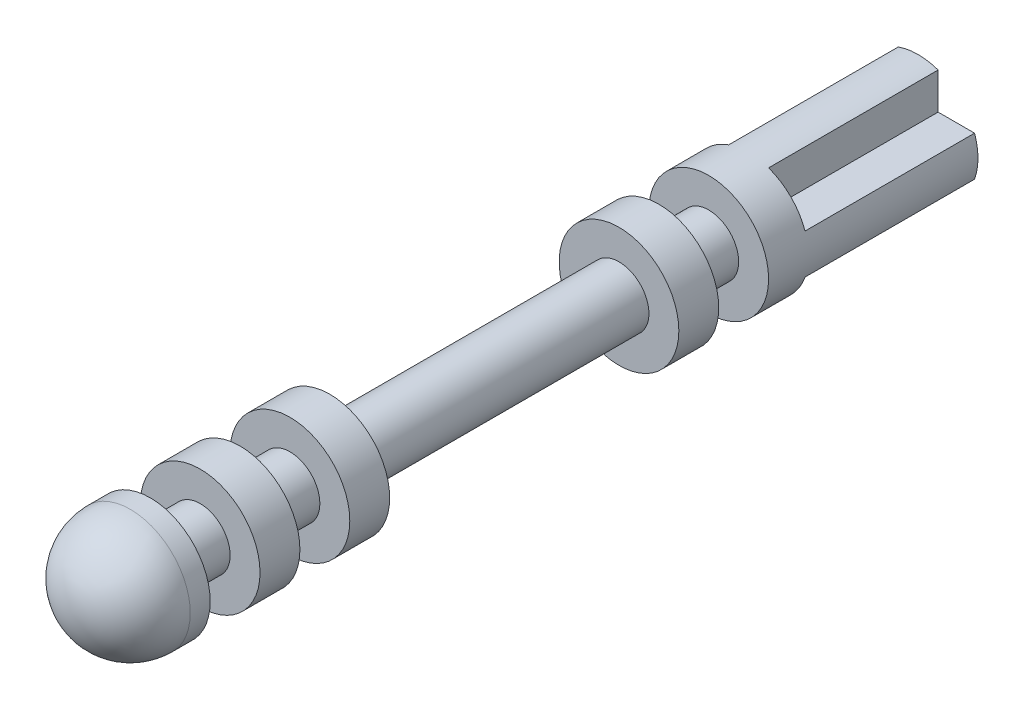
ISO-10303-21;
HEADER;
FILE_DESCRIPTION(('STEP AP214'),'2;1');
FILE_NAME('part.step','',(''),(''),'','','');
FILE_SCHEMA(('AUTOMOTIVE_DESIGN { 1 0 10303 214 1 1 1 1 }'));
ENDSEC;
DATA;
#1=APPLICATION_CONTEXT('core data for automotive mechanical design processes');
#2=APPLICATION_PROTOCOL_DEFINITION('international standard','automotive_design',2000,#1);
#3=PRODUCT_CONTEXT('',#1,'mechanical');
#4=PRODUCT('Part','Part','',(#3));
#5=PRODUCT_RELATED_PRODUCT_CATEGORY('part','',(#4));
#6=PRODUCT_DEFINITION_FORMATION('','',#4);
#7=PRODUCT_DEFINITION_CONTEXT('part definition',#1,'design');
#8=PRODUCT_DEFINITION('design','',#6,#7);
#9=PRODUCT_DEFINITION_SHAPE('','',#8);
#10=(LENGTH_UNIT() NAMED_UNIT(*) SI_UNIT(.MILLI.,.METRE.));
#11=(NAMED_UNIT(*) PLANE_ANGLE_UNIT() SI_UNIT($,.RADIAN.));
#12=(NAMED_UNIT(*) SI_UNIT($,.STERADIAN.) SOLID_ANGLE_UNIT());
#13=UNCERTAINTY_MEASURE_WITH_UNIT(LENGTH_MEASURE(1.E-05),#10,'distance_accuracy_value','');
#14=(GEOMETRIC_REPRESENTATION_CONTEXT(3) GLOBAL_UNCERTAINTY_ASSIGNED_CONTEXT((#13)) GLOBAL_UNIT_ASSIGNED_CONTEXT((#10,
#11,#12)) REPRESENTATION_CONTEXT('',''));
#15=CARTESIAN_POINT('',(0.,0.,0.));
#16=DIRECTION('',(0.,0.,1.));
#17=DIRECTION('',(1.,0.,0.));
#18=AXIS2_PLACEMENT_3D('',#15,#16,#17);
#19=CARTESIAN_POINT('',(0.,0.,10.5));
#20=DIRECTION('',(0.,0.,-1.));
#21=DIRECTION('',(-1.,0.,0.));
#22=AXIS2_PLACEMENT_3D('',#19,#20,#21);
#23=CYLINDRICAL_SURFACE('',#22,3.);
#24=CARTESIAN_POINT('',(0.,0.,10.5));
#25=DIRECTION('',(0.,0.,1.));
#26=DIRECTION('',(1.,0.,0.));
#27=AXIS2_PLACEMENT_3D('',#24,#25,#26);
#28=CIRCLE('',#27,3.);
#29=CARTESIAN_POINT('',(3.,0.,10.5));
#30=VERTEX_POINT('',#29);
#31=EDGE_CURVE('E305',#30,#30,#28,.T.);
#32=ORIENTED_EDGE('',*,*,#31,.F.);
#33=EDGE_LOOP('',(#32));
#34=FACE_BOUND('',#33,.T.);
#35=DIRECTION('',(0.,0.,1.));
#36=VECTOR('',#35,1.);
#37=CARTESIAN_POINT('',(-1.,-2.82842712474619,-93.5484771359565));
#38=LINE('',#37,#36);
#39=CARTESIAN_POINT('',(-1.,-2.82842712474619,0.));
#40=VERTEX_POINT('',#39);
#41=CARTESIAN_POINT('',(-1.,-2.82842712474619,8.5));
#42=VERTEX_POINT('',#41);
#43=EDGE_CURVE('E163',#40,#42,#38,.T.);
#44=ORIENTED_EDGE('',*,*,#43,.F.);
#45=CARTESIAN_POINT('',(0.,0.,0.));
#46=DIRECTION('',(0.,0.,1.));
#47=DIRECTION('',(1.,0.,0.));
#48=AXIS2_PLACEMENT_3D('',#45,#46,#47);
#49=CIRCLE('',#48,3.);
#50=CARTESIAN_POINT('',(1.,-2.82842712474619,0.));
#51=VERTEX_POINT('',#50);
#52=EDGE_CURVE('E314',#40,#51,#49,.T.);
#53=ORIENTED_EDGE('',*,*,#52,.T.);
#54=DIRECTION('',(0.,0.,1.));
#55=VECTOR('',#54,1.);
#56=CARTESIAN_POINT('',(1.,-2.82842712474619,-93.5484771359565));
#57=LINE('',#56,#55);
#58=CARTESIAN_POINT('',(1.,-2.82842712474619,8.5));
#59=VERTEX_POINT('',#58);
#60=EDGE_CURVE('E194',#51,#59,#57,.T.);
#61=ORIENTED_EDGE('',*,*,#60,.T.);
#62=CARTESIAN_POINT('',(0.,0.,8.5));
#63=DIRECTION('',(0.,0.,-1.));
#64=DIRECTION('',(1.,0.,0.));
#65=AXIS2_PLACEMENT_3D('',#62,#63,#64);
#66=CIRCLE('',#65,3.);
#67=CARTESIAN_POINT('',(2.82842712474619,-1.,8.5));
#68=VERTEX_POINT('',#67);
#69=EDGE_CURVE('E171',#68,#59,#66,.T.);
#70=ORIENTED_EDGE('',*,*,#69,.F.);
#71=DIRECTION('',(0.,0.,1.));
#72=VECTOR('',#71,1.);
#73=CARTESIAN_POINT('',(2.82842712474619,-1.,-93.5484771359565));
#74=LINE('',#73,#72);
#75=CARTESIAN_POINT('',(2.82842712474619,-1.,0.));
#76=VERTEX_POINT('',#75);
#77=EDGE_CURVE('E188',#76,#68,#74,.T.);
#78=ORIENTED_EDGE('',*,*,#77,.F.);
#79=CARTESIAN_POINT('',(2.82842712474619,1.,0.));
#80=VERTEX_POINT('',#79);
#81=EDGE_CURVE('E304',#76,#80,#49,.T.);
#82=ORIENTED_EDGE('',*,*,#81,.T.);
#83=DIRECTION('',(0.,0.,1.));
#84=VECTOR('',#83,1.);
#85=CARTESIAN_POINT('',(2.82842712474619,1.,-93.5484771359565));
#86=LINE('',#85,#84);
#87=CARTESIAN_POINT('',(2.82842712474619,1.,8.5));
#88=VERTEX_POINT('',#87);
#89=EDGE_CURVE('E232',#80,#88,#86,.T.);
#90=ORIENTED_EDGE('',*,*,#89,.T.);
#91=CARTESIAN_POINT('',(0.,0.,8.5));
#92=DIRECTION('',(0.,0.,1.));
#93=DIRECTION('',(1.,0.,0.));
#94=AXIS2_PLACEMENT_3D('',#91,#92,#93);
#95=CIRCLE('',#94,3.);
#96=CARTESIAN_POINT('',(1.,2.82842712474619,8.5));
#97=VERTEX_POINT('',#96);
#98=EDGE_CURVE('E227',#88,#97,#95,.T.);
#99=ORIENTED_EDGE('',*,*,#98,.T.);
#100=DIRECTION('',(0.,0.,1.));
#101=VECTOR('',#100,1.);
#102=CARTESIAN_POINT('',(1.,2.82842712474619,-93.5484771359565));
#103=LINE('',#102,#101);
#104=CARTESIAN_POINT('',(1.,2.82842712474619,0.));
#105=VERTEX_POINT('',#104);
#106=EDGE_CURVE('E248',#105,#97,#103,.T.);
#107=ORIENTED_EDGE('',*,*,#106,.F.);
#108=CARTESIAN_POINT('',(-1.,2.82842712474619,0.));
#109=VERTEX_POINT('',#108);
#110=EDGE_CURVE('E310',#105,#109,#49,.T.);
#111=ORIENTED_EDGE('',*,*,#110,.T.);
#112=DIRECTION('',(0.,0.,1.));
#113=VECTOR('',#112,1.);
#114=CARTESIAN_POINT('',(-1.,2.82842712474619,-93.5484771359565));
#115=LINE('',#114,#113);
#116=CARTESIAN_POINT('',(-1.,2.82842712474619,8.5));
#117=VERTEX_POINT('',#116);
#118=EDGE_CURVE('E223',#109,#117,#115,.T.);
#119=ORIENTED_EDGE('',*,*,#118,.T.);
#120=CARTESIAN_POINT('',(0.,0.,8.5));
#121=DIRECTION('',(0.,0.,-1.));
#122=DIRECTION('',(-1.,0.,0.));
#123=AXIS2_PLACEMENT_3D('',#120,#121,#122);
#124=CIRCLE('',#123,3.);
#125=CARTESIAN_POINT('',(-2.82842712474619,1.,8.5));
#126=VERTEX_POINT('',#125);
#127=EDGE_CURVE('E198',#126,#117,#124,.T.);
#128=ORIENTED_EDGE('',*,*,#127,.F.);
#129=DIRECTION('',(0.,0.,1.));
#130=VECTOR('',#129,1.);
#131=CARTESIAN_POINT('',(-2.82842712474619,1.,-93.5484771359565));
#132=LINE('',#131,#130);
#133=CARTESIAN_POINT('',(-2.82842712474619,1.,0.));
#134=VERTEX_POINT('',#133);
#135=EDGE_CURVE('E216',#134,#126,#132,.T.);
#136=ORIENTED_EDGE('',*,*,#135,.F.);
#137=CARTESIAN_POINT('',(-2.82842712474619,-1.,0.));
#138=VERTEX_POINT('',#137);
#139=EDGE_CURVE('E156',#134,#138,#49,.T.);
#140=ORIENTED_EDGE('',*,*,#139,.T.);
#141=DIRECTION('',(0.,0.,1.));
#142=VECTOR('',#141,1.);
#143=CARTESIAN_POINT('',(-2.82842712474619,-1.,-93.5484771359565));
#144=LINE('',#143,#142);
#145=CARTESIAN_POINT('',(-2.82842712474619,-1.,8.5));
#146=VERTEX_POINT('',#145);
#147=EDGE_CURVE('E61',#138,#146,#144,.T.);
#148=ORIENTED_EDGE('',*,*,#147,.T.);
#149=CARTESIAN_POINT('',(0.,0.,8.5));
#150=DIRECTION('',(0.,0.,1.));
#151=DIRECTION('',(-1.,0.,0.));
#152=AXIS2_PLACEMENT_3D('',#149,#150,#151);
#153=CIRCLE('',#152,3.);
#154=EDGE_CURVE('E137',#146,#42,#153,.T.);
#155=ORIENTED_EDGE('',*,*,#154,.T.);
#156=EDGE_LOOP('',(#44,#53,#61,#70,#78,#82,#90,#99,#107,#111,#119,#128,#136,#140,#148,#155));
#157=FACE_BOUND('',#156,.T.);
#158=ADVANCED_FACE('F45',(#34,#157),#23,.T.);
#159=CARTESIAN_POINT('',(0.,0.,0.));
#160=DIRECTION('',(0.,0.,1.));
#161=DIRECTION('',(1.,0.,0.));
#162=AXIS2_PLACEMENT_3D('',#159,#160,#161);
#163=PLANE('',#162);
#164=DIRECTION('',(0.,1.,0.));
#165=VECTOR('',#164,1.);
#166=CARTESIAN_POINT('',(-1.,-1.,0.));
#167=LINE('',#166,#165);
#168=CARTESIAN_POINT('',(-1.,-1.,0.));
#169=VERTEX_POINT('',#168);
#170=EDGE_CURVE('E158',#40,#169,#167,.T.);
#171=ORIENTED_EDGE('',*,*,#170,.T.);
#172=DIRECTION('',(-1.,0.,0.));
#173=VECTOR('',#172,1.);
#174=CARTESIAN_POINT('',(-2.82842712474619,-1.,0.));
#175=LINE('',#174,#173);
#176=EDGE_CURVE('E165',#169,#138,#175,.T.);
#177=ORIENTED_EDGE('',*,*,#176,.T.);
#178=ORIENTED_EDGE('',*,*,#139,.F.);
#179=DIRECTION('',(-1.,0.,0.));
#180=VECTOR('',#179,1.);
#181=CARTESIAN_POINT('',(-2.82842712474619,1.,0.));
#182=LINE('',#181,#180);
#183=CARTESIAN_POINT('',(-1.,1.,0.));
#184=VERTEX_POINT('',#183);
#185=EDGE_CURVE('E209',#184,#134,#182,.T.);
#186=ORIENTED_EDGE('',*,*,#185,.F.);
#187=DIRECTION('',(0.,-1.,0.));
#188=VECTOR('',#187,1.);
#189=CARTESIAN_POINT('',(-1.,1.,0.));
#190=LINE('',#189,#188);
#191=EDGE_CURVE('E220',#109,#184,#190,.T.);
#192=ORIENTED_EDGE('',*,*,#191,.F.);
#193=ORIENTED_EDGE('',*,*,#110,.F.);
#194=DIRECTION('',(0.,-1.,0.));
#195=VECTOR('',#194,1.);
#196=CARTESIAN_POINT('',(1.,1.,0.));
#197=LINE('',#196,#195);
#198=CARTESIAN_POINT('',(1.,1.,0.));
#199=VERTEX_POINT('',#198);
#200=EDGE_CURVE('E238',#105,#199,#197,.T.);
#201=ORIENTED_EDGE('',*,*,#200,.T.);
#202=DIRECTION('',(1.,0.,0.));
#203=VECTOR('',#202,1.);
#204=CARTESIAN_POINT('',(2.82842712474619,1.,0.));
#205=LINE('',#204,#203);
#206=EDGE_CURVE('E237',#199,#80,#205,.T.);
#207=ORIENTED_EDGE('',*,*,#206,.T.);
#208=ORIENTED_EDGE('',*,*,#81,.F.);
#209=DIRECTION('',(1.,0.,0.));
#210=VECTOR('',#209,1.);
#211=CARTESIAN_POINT('',(2.82842712474619,-1.,0.));
#212=LINE('',#211,#210);
#213=CARTESIAN_POINT('',(1.,-1.,0.));
#214=VERTEX_POINT('',#213);
#215=EDGE_CURVE('E182',#214,#76,#212,.T.);
#216=ORIENTED_EDGE('',*,*,#215,.F.);
#217=DIRECTION('',(0.,1.,0.));
#218=VECTOR('',#217,1.);
#219=CARTESIAN_POINT('',(1.,-1.,0.));
#220=LINE('',#219,#218);
#221=EDGE_CURVE('E69',#51,#214,#220,.T.);
#222=ORIENTED_EDGE('',*,*,#221,.F.);
#223=ORIENTED_EDGE('',*,*,#52,.F.);
#224=EDGE_LOOP('',(#171,#177,#178,#186,#192,#193,#201,#207,#208,#216,#222,#223));
#225=FACE_BOUND('',#224,.T.);
#226=ADVANCED_FACE('F355',(#225),#163,.F.);
#227=CARTESIAN_POINT('',(0.,0.,38.5));
#228=DIRECTION('',(0.,0.,-1.));
#229=DIRECTION('',(-1.,0.,0.));
#230=AXIS2_PLACEMENT_3D('',#227,#228,#229);
#231=CYLINDRICAL_SURFACE('',#230,1.5);
#232=CARTESIAN_POINT('',(0.,0.,31.5));
#233=DIRECTION('',(0.,0.,1.));
#234=DIRECTION('',(1.,0.,0.));
#235=AXIS2_PLACEMENT_3D('',#232,#233,#234);
#236=CIRCLE('',#235,1.5);
#237=CARTESIAN_POINT('',(1.5,0.,31.5));
#238=VERTEX_POINT('',#237);
#239=EDGE_CURVE('E275',#238,#238,#236,.T.);
#240=ORIENTED_EDGE('',*,*,#239,.T.);
#241=EDGE_LOOP('',(#240));
#242=FACE_BOUND('',#241,.T.);
#243=CARTESIAN_POINT('',(0.,0.,34.));
#244=DIRECTION('',(0.,0.,1.));
#245=DIRECTION('',(1.,0.,0.));
#246=AXIS2_PLACEMENT_3D('',#243,#244,#245);
#247=CIRCLE('',#246,1.5);
#248=CARTESIAN_POINT('',(1.5,0.,34.));
#249=VERTEX_POINT('',#248);
#250=EDGE_CURVE('E54',#249,#249,#247,.T.);
#251=ORIENTED_EDGE('',*,*,#250,.F.);
#252=EDGE_LOOP('',(#251));
#253=FACE_BOUND('',#252,.T.);
#254=ADVANCED_FACE('F352',(#242,#253),#231,.T.);
#255=CARTESIAN_POINT('',(0.,0.,15.));
#256=DIRECTION('',(0.,0.,1.));
#257=DIRECTION('',(1.,0.,0.));
#258=AXIS2_PLACEMENT_3D('',#255,#256,#257);
#259=CIRCLE('',#258,1.5);
#260=CARTESIAN_POINT('',(1.5,0.,15.));
#261=VERTEX_POINT('',#260);
#262=EDGE_CURVE('E284',#261,#261,#259,.F.);
#263=ORIENTED_EDGE('',*,*,#262,.F.);
#264=EDGE_LOOP('',(#263));
#265=FACE_BOUND('',#264,.T.);
#266=CARTESIAN_POINT('',(0.,0.,29.5));
#267=DIRECTION('',(0.,0.,1.));
#268=DIRECTION('',(1.,0.,0.));
#269=AXIS2_PLACEMENT_3D('',#266,#267,#268);
#270=CIRCLE('',#269,1.5);
#271=CARTESIAN_POINT('',(1.5,0.,29.5));
#272=VERTEX_POINT('',#271);
#273=EDGE_CURVE('E309',#272,#272,#270,.T.);
#274=ORIENTED_EDGE('',*,*,#273,.F.);
#275=EDGE_LOOP('',(#274));
#276=FACE_BOUND('',#275,.T.);
#277=ADVANCED_FACE('F353',(#265,#276),#231,.T.);
#278=CARTESIAN_POINT('',(0.,0.,10.5));
#279=DIRECTION('',(0.,0.,1.));
#280=DIRECTION('',(1.,0.,0.));
#281=AXIS2_PLACEMENT_3D('',#278,#279,#280);
#282=PLANE('',#281);
#283=CARTESIAN_POINT('',(0.,0.,10.5));
#284=DIRECTION('',(0.,0.,1.));
#285=DIRECTION('',(1.,0.,0.));
#286=AXIS2_PLACEMENT_3D('',#283,#284,#285);
#287=CIRCLE('',#286,1.5);
#288=CARTESIAN_POINT('',(-1.5,0.,10.5));
#289=VERTEX_POINT('',#288);
#290=EDGE_CURVE('E300',#289,#289,#287,.F.);
#291=ORIENTED_EDGE('',*,*,#290,.T.);
#292=EDGE_LOOP('',(#291));
#293=FACE_BOUND('',#292,.T.);
#294=ORIENTED_EDGE('',*,*,#31,.T.);
#295=EDGE_LOOP('',(#294));
#296=FACE_BOUND('',#295,.T.);
#297=ADVANCED_FACE('F365',(#293,#296),#282,.T.);
#298=CARTESIAN_POINT('',(0.,0.,13.));
#299=DIRECTION('',(0.,0.,-1.));
#300=DIRECTION('',(-1.,0.,0.));
#301=AXIS2_PLACEMENT_3D('',#298,#299,#300);
#302=CYLINDRICAL_SURFACE('',#301,1.5);
#303=CARTESIAN_POINT('',(0.,0.,13.));
#304=DIRECTION('',(0.,0.,1.));
#305=DIRECTION('',(1.,0.,0.));
#306=AXIS2_PLACEMENT_3D('',#303,#304,#305);
#307=CIRCLE('',#306,1.5);
#308=CARTESIAN_POINT('',(-1.5,0.,13.));
#309=VERTEX_POINT('',#308);
#310=EDGE_CURVE('E293',#309,#309,#307,.T.);
#311=CARTESIAN_POINT('',(-1.5,0.,10.5));
#312=CARTESIAN_POINT('',(-1.5,0.,10.5260416666667));
#313=CARTESIAN_POINT('',(-1.5,0.,10.5520833333333));
#314=CARTESIAN_POINT('',(-1.5,0.,10.6041666666667));
#315=CARTESIAN_POINT('',(-1.5,0.,10.6302083333333));
#316=CARTESIAN_POINT('',(-1.5,0.,10.6822916666667));
#317=CARTESIAN_POINT('',(-1.5,0.,10.7083333333333));
#318=CARTESIAN_POINT('',(-1.5,0.,10.7604166666667));
#319=CARTESIAN_POINT('',(-1.5,0.,10.7864583333333));
#320=CARTESIAN_POINT('',(-1.5,0.,10.8385416666667));
#321=CARTESIAN_POINT('',(-1.5,0.,10.8645833333333));
#322=CARTESIAN_POINT('',(-1.5,0.,10.9166666666667));
#323=CARTESIAN_POINT('',(-1.5,0.,10.9427083333333));
#324=CARTESIAN_POINT('',(-1.5,0.,10.9947916666667));
#325=CARTESIAN_POINT('',(-1.5,0.,11.0208333333333));
#326=CARTESIAN_POINT('',(-1.5,0.,11.0729166666667));
#327=CARTESIAN_POINT('',(-1.5,0.,11.0989583333333));
#328=CARTESIAN_POINT('',(-1.5,0.,11.1510416666667));
#329=CARTESIAN_POINT('',(-1.5,0.,11.1770833333333));
#330=CARTESIAN_POINT('',(-1.5,0.,11.2291666666667));
#331=CARTESIAN_POINT('',(-1.5,0.,11.2552083333333));
#332=CARTESIAN_POINT('',(-1.5,0.,11.3072916666667));
#333=CARTESIAN_POINT('',(-1.5,0.,11.3333333333333));
#334=CARTESIAN_POINT('',(-1.5,0.,11.3854166666667));
#335=CARTESIAN_POINT('',(-1.5,0.,11.4114583333333));
#336=CARTESIAN_POINT('',(-1.5,0.,11.4635416666667));
#337=CARTESIAN_POINT('',(-1.5,0.,11.4895833333333));
#338=CARTESIAN_POINT('',(-1.5,0.,11.5416666666667));
#339=CARTESIAN_POINT('',(-1.5,0.,11.5677083333333));
#340=CARTESIAN_POINT('',(-1.5,0.,11.6197916666667));
#341=CARTESIAN_POINT('',(-1.5,0.,11.6458333333333));
#342=CARTESIAN_POINT('',(-1.5,0.,11.6979166666667));
#343=CARTESIAN_POINT('',(-1.5,0.,11.7239583333333));
#344=CARTESIAN_POINT('',(-1.5,0.,11.7760416666667));
#345=CARTESIAN_POINT('',(-1.5,0.,11.8020833333333));
#346=CARTESIAN_POINT('',(-1.5,0.,11.8541666666667));
#347=CARTESIAN_POINT('',(-1.5,0.,11.8802083333333));
#348=CARTESIAN_POINT('',(-1.5,0.,11.9322916666667));
#349=CARTESIAN_POINT('',(-1.5,0.,11.9583333333333));
#350=CARTESIAN_POINT('',(-1.5,0.,12.0104166666667));
#351=CARTESIAN_POINT('',(-1.5,0.,12.0364583333333));
#352=CARTESIAN_POINT('',(-1.5,0.,12.0885416666667));
#353=CARTESIAN_POINT('',(-1.5,0.,12.1145833333333));
#354=CARTESIAN_POINT('',(-1.5,0.,12.1666666666667));
#355=CARTESIAN_POINT('',(-1.5,0.,12.1927083333333));
#356=CARTESIAN_POINT('',(-1.5,0.,12.2447916666667));
#357=CARTESIAN_POINT('',(-1.5,0.,12.2708333333333));
#358=CARTESIAN_POINT('',(-1.5,0.,12.3229166666667));
#359=CARTESIAN_POINT('',(-1.5,0.,12.3489583333333));
#360=CARTESIAN_POINT('',(-1.5,0.,12.4010416666667));
#361=CARTESIAN_POINT('',(-1.5,0.,12.4270833333333));
#362=CARTESIAN_POINT('',(-1.5,0.,12.4791666666667));
#363=CARTESIAN_POINT('',(-1.5,0.,12.5052083333333));
#364=CARTESIAN_POINT('',(-1.5,0.,12.5572916666667));
#365=CARTESIAN_POINT('',(-1.5,0.,12.5833333333333));
#366=CARTESIAN_POINT('',(-1.5,0.,12.6354166666667));
#367=CARTESIAN_POINT('',(-1.5,0.,12.6614583333333));
#368=CARTESIAN_POINT('',(-1.5,0.,12.7135416666667));
#369=CARTESIAN_POINT('',(-1.5,0.,12.7395833333333));
#370=CARTESIAN_POINT('',(-1.5,0.,12.7916666666667));
#371=CARTESIAN_POINT('',(-1.5,0.,12.8177083333333));
#372=CARTESIAN_POINT('',(-1.5,0.,12.8697916666667));
#373=CARTESIAN_POINT('',(-1.5,0.,12.8958333333333));
#374=CARTESIAN_POINT('',(-1.5,0.,12.9479166666667));
#375=CARTESIAN_POINT('',(-1.5,0.,12.9739583333333));
#376=CARTESIAN_POINT('',(-1.5,0.,13.));
#377=B_SPLINE_CURVE_WITH_KNOTS('',3,(#311,#312,#313,#314,#315,#316,#317,#318,#319,#320,#321,
#322,#323,#324,#325,#326,#327,#328,#329,#330,#331,#332,#333,#334,#335,#336,#337,#338,#339,#340,
#341,#342,#343,#344,#345,#346,#347,#348,#349,#350,#351,#352,#353,#354,#355,#356,#357,#358,#359,
#360,#361,#362,#363,#364,#365,#366,#367,#368,#369,#370,#371,#372,#373,#374,#375,#376),
.UNSPECIFIED.,.F.,.F.,(4,2,2,2,2,2,2,2,2,2,2,2,2,2,2,2,2,2,2,2,2,2,2,2,2,2,2,2,2,2,2,2,4),(0.,
0.0781250000000001,0.15625,0.234375,0.312499999999999,0.390625,0.468749999999999,
0.546874999999999,0.624999999999999,0.703124999999999,0.781249999999999,0.859374999999999,
0.937499999999999,1.015625,1.09375,1.171875,1.25,1.328125,1.40625,1.484375,1.5625,1.640625,
1.71875,1.796875,1.875,1.953125,2.03125,2.109375,2.1875,2.265625,2.34375,2.421875,2.5),.UNSPECIFIED.);
#378=EDGE_CURVE('BSEAM368',#289,#309,#377,.T.);
#379=ORIENTED_EDGE('',*,*,#290,.F.);
#380=ORIENTED_EDGE('',*,*,#310,.F.);
#381=ORIENTED_EDGE('',*,*,#378,.T.);
#382=ORIENTED_EDGE('',*,*,#378,.F.);
#383=EDGE_LOOP('',(#379,#381,#380,#382));
#384=FACE_BOUND('',#383,.T.);
#385=ADVANCED_FACE('F368',(#384),#302,.T.);
#386=CARTESIAN_POINT('',(0.,0.,15.));
#387=DIRECTION('',(0.,0.,-1.));
#388=DIRECTION('',(-1.,0.,0.));
#389=AXIS2_PLACEMENT_3D('',#386,#387,#388);
#390=CYLINDRICAL_SURFACE('',#389,3.);
#391=CARTESIAN_POINT('',(0.,0.,15.));
#392=DIRECTION('',(0.,0.,1.));
#393=DIRECTION('',(1.,0.,0.));
#394=AXIS2_PLACEMENT_3D('',#391,#392,#393);
#395=CIRCLE('',#394,3.);
#396=CARTESIAN_POINT('',(3.,0.,15.));
#397=VERTEX_POINT('',#396);
#398=EDGE_CURVE('E289',#397,#397,#395,.T.);
#399=ORIENTED_EDGE('',*,*,#398,.F.);
#400=EDGE_LOOP('',(#399));
#401=FACE_BOUND('',#400,.T.);
#402=CARTESIAN_POINT('',(0.,0.,13.));
#403=DIRECTION('',(0.,0.,1.));
#404=DIRECTION('',(1.,0.,0.));
#405=AXIS2_PLACEMENT_3D('',#402,#403,#404);
#406=CIRCLE('',#405,3.);
#407=CARTESIAN_POINT('',(3.,0.,13.));
#408=VERTEX_POINT('',#407);
#409=EDGE_CURVE('E288',#408,#408,#406,.T.);
#410=ORIENTED_EDGE('',*,*,#409,.T.);
#411=EDGE_LOOP('',(#410));
#412=FACE_BOUND('',#411,.T.);
#413=ADVANCED_FACE('F372',(#401,#412),#390,.T.);
#414=CARTESIAN_POINT('',(0.,0.,15.));
#415=DIRECTION('',(0.,0.,1.));
#416=DIRECTION('',(1.,0.,0.));
#417=AXIS2_PLACEMENT_3D('',#414,#415,#416);
#418=PLANE('',#417);
#419=ORIENTED_EDGE('',*,*,#262,.T.);
#420=EDGE_LOOP('',(#419));
#421=FACE_BOUND('',#420,.T.);
#422=ORIENTED_EDGE('',*,*,#398,.T.);
#423=EDGE_LOOP('',(#422));
#424=FACE_BOUND('',#423,.T.);
#425=ADVANCED_FACE('F376',(#421,#424),#418,.T.);
#426=CARTESIAN_POINT('',(0.,0.,13.));
#427=DIRECTION('',(0.,0.,1.));
#428=DIRECTION('',(1.,0.,0.));
#429=AXIS2_PLACEMENT_3D('',#426,#427,#428);
#430=PLANE('',#429);
#431=ORIENTED_EDGE('',*,*,#310,.T.);
#432=EDGE_LOOP('',(#431));
#433=FACE_BOUND('',#432,.T.);
#434=ORIENTED_EDGE('',*,*,#409,.F.);
#435=EDGE_LOOP('',(#434));
#436=FACE_BOUND('',#435,.T.);
#437=ADVANCED_FACE('F378',(#433,#436),#430,.F.);
#438=CARTESIAN_POINT('',(0.,0.,31.5));
#439=DIRECTION('',(0.,0.,-1.));
#440=DIRECTION('',(-1.,0.,0.));
#441=AXIS2_PLACEMENT_3D('',#438,#439,#440);
#442=CYLINDRICAL_SURFACE('',#441,3.);
#443=CARTESIAN_POINT('',(0.,0.,31.5));
#444=DIRECTION('',(0.,0.,1.));
#445=DIRECTION('',(1.,0.,0.));
#446=AXIS2_PLACEMENT_3D('',#443,#444,#445);
#447=CIRCLE('',#446,3.);
#448=CARTESIAN_POINT('',(3.,0.,31.5));
#449=VERTEX_POINT('',#448);
#450=EDGE_CURVE('E271',#449,#449,#447,.T.);
#451=ORIENTED_EDGE('',*,*,#450,.F.);
#452=EDGE_LOOP('',(#451));
#453=FACE_BOUND('',#452,.T.);
#454=CARTESIAN_POINT('',(0.,0.,29.5));
#455=DIRECTION('',(0.,0.,1.));
#456=DIRECTION('',(1.,0.,0.));
#457=AXIS2_PLACEMENT_3D('',#454,#455,#456);
#458=CIRCLE('',#457,3.);
#459=CARTESIAN_POINT('',(3.,0.,29.5));
#460=VERTEX_POINT('',#459);
#461=EDGE_CURVE('E276',#460,#460,#458,.T.);
#462=ORIENTED_EDGE('',*,*,#461,.T.);
#463=EDGE_LOOP('',(#462));
#464=FACE_BOUND('',#463,.T.);
#465=ADVANCED_FACE('F381',(#453,#464),#442,.T.);
#466=CARTESIAN_POINT('',(0.,0.,31.5));
#467=DIRECTION('',(0.,0.,1.));
#468=DIRECTION('',(1.,0.,0.));
#469=AXIS2_PLACEMENT_3D('',#466,#467,#468);
#470=PLANE('',#469);
#471=ORIENTED_EDGE('',*,*,#239,.F.);
#472=EDGE_LOOP('',(#471));
#473=FACE_BOUND('',#472,.T.);
#474=ORIENTED_EDGE('',*,*,#450,.T.);
#475=EDGE_LOOP('',(#474));
#476=FACE_BOUND('',#475,.T.);
#477=ADVANCED_FACE('F388',(#473,#476),#470,.T.);
#478=CARTESIAN_POINT('',(0.,0.,29.5));
#479=DIRECTION('',(0.,0.,1.));
#480=DIRECTION('',(1.,0.,0.));
#481=AXIS2_PLACEMENT_3D('',#478,#479,#480);
#482=PLANE('',#481);
#483=ORIENTED_EDGE('',*,*,#273,.T.);
#484=EDGE_LOOP('',(#483));
#485=FACE_BOUND('',#484,.T.);
#486=ORIENTED_EDGE('',*,*,#461,.F.);
#487=EDGE_LOOP('',(#486));
#488=FACE_BOUND('',#487,.T.);
#489=ADVANCED_FACE('F340',(#485,#488),#482,.F.);
#490=CARTESIAN_POINT('',(0.,0.,36.));
#491=DIRECTION('',(0.,0.,-1.));
#492=DIRECTION('',(-1.,0.,0.));
#493=AXIS2_PLACEMENT_3D('',#490,#491,#492);
#494=CYLINDRICAL_SURFACE('',#493,3.);
#495=CARTESIAN_POINT('',(0.,0.,36.));
#496=DIRECTION('',(0.,0.,1.));
#497=DIRECTION('',(1.,0.,0.));
#498=AXIS2_PLACEMENT_3D('',#495,#496,#497);
#499=CIRCLE('',#498,3.);
#500=CARTESIAN_POINT('',(3.,0.,36.));
#501=VERTEX_POINT('',#500);
#502=EDGE_CURVE('E263',#501,#501,#499,.T.);
#503=ORIENTED_EDGE('',*,*,#502,.F.);
#504=EDGE_LOOP('',(#503));
#505=FACE_BOUND('',#504,.T.);
#506=CARTESIAN_POINT('',(0.,0.,34.));
#507=DIRECTION('',(0.,0.,1.));
#508=DIRECTION('',(1.,0.,0.));
#509=AXIS2_PLACEMENT_3D('',#506,#507,#508);
#510=CIRCLE('',#509,3.);
#511=CARTESIAN_POINT('',(3.,0.,34.));
#512=VERTEX_POINT('',#511);
#513=EDGE_CURVE('E262',#512,#512,#510,.T.);
#514=ORIENTED_EDGE('',*,*,#513,.T.);
#515=EDGE_LOOP('',(#514));
#516=FACE_BOUND('',#515,.T.);
#517=ADVANCED_FACE('F334',(#505,#516),#494,.T.);
#518=CARTESIAN_POINT('',(0.,0.,36.));
#519=DIRECTION('',(0.,0.,1.));
#520=DIRECTION('',(1.,0.,0.));
#521=AXIS2_PLACEMENT_3D('',#518,#519,#520);
#522=PLANE('',#521);
#523=CARTESIAN_POINT('',(0.,0.,36.));
#524=DIRECTION('',(0.,0.,1.));
#525=DIRECTION('',(1.,0.,0.));
#526=AXIS2_PLACEMENT_3D('',#523,#524,#525);
#527=CIRCLE('',#526,1.5);
#528=CARTESIAN_POINT('',(1.5,0.,36.));
#529=VERTEX_POINT('',#528);
#530=EDGE_CURVE('E267',#529,#529,#527,.T.);
#531=ORIENTED_EDGE('',*,*,#530,.F.);
#532=EDGE_LOOP('',(#531));
#533=FACE_BOUND('',#532,.T.);
#534=ORIENTED_EDGE('',*,*,#502,.T.);
#535=EDGE_LOOP('',(#534));
#536=FACE_BOUND('',#535,.T.);
#537=ADVANCED_FACE('F330',(#533,#536),#522,.T.);
#538=CARTESIAN_POINT('',(0.,0.,34.));
#539=DIRECTION('',(0.,0.,1.));
#540=DIRECTION('',(1.,0.,0.));
#541=AXIS2_PLACEMENT_3D('',#538,#539,#540);
#542=PLANE('',#541);
#543=ORIENTED_EDGE('',*,*,#250,.T.);
#544=EDGE_LOOP('',(#543));
#545=FACE_BOUND('',#544,.T.);
#546=ORIENTED_EDGE('',*,*,#513,.F.);
#547=EDGE_LOOP('',(#546));
#548=FACE_BOUND('',#547,.T.);
#549=ADVANCED_FACE('F333',(#545,#548),#542,.F.);
#550=ORIENTED_EDGE('',*,*,#530,.T.);
#551=EDGE_LOOP('',(#550));
#552=FACE_BOUND('',#551,.T.);
#553=CARTESIAN_POINT('',(0.,0.,38.5));
#554=DIRECTION('',(0.,0.,1.));
#555=DIRECTION('',(1.,0.,0.));
#556=AXIS2_PLACEMENT_3D('',#553,#554,#555);
#557=CIRCLE('',#556,1.5);
#558=CARTESIAN_POINT('',(1.5,0.,38.5));
#559=VERTEX_POINT('',#558);
#560=EDGE_CURVE('E280',#559,#559,#557,.T.);
#561=ORIENTED_EDGE('',*,*,#560,.F.);
#562=EDGE_LOOP('',(#561));
#563=FACE_BOUND('',#562,.T.);
#564=ADVANCED_FACE('F327',(#552,#563),#231,.T.);
#565=CARTESIAN_POINT('',(0.,0.,42.5));
#566=DIRECTION('',(0.,0.,-1.));
#567=DIRECTION('',(-1.,0.,0.));
#568=AXIS2_PLACEMENT_3D('',#565,#566,#567);
#569=CYLINDRICAL_SURFACE('',#568,3.);
#570=CARTESIAN_POINT('',(0.,0.,39.5));
#571=DIRECTION('',(0.,0.,-1.));
#572=DIRECTION('',(-1.,0.,0.));
#573=AXIS2_PLACEMENT_3D('',#570,#571,#572);
#574=CIRCLE('',#573,3.);
#575=CARTESIAN_POINT('',(-3.,0.,39.5));
#576=VERTEX_POINT('',#575);
#577=EDGE_CURVE('E11',#576,#576,#574,.T.);
#578=ORIENTED_EDGE('',*,*,#577,.T.);
#579=EDGE_LOOP('',(#578));
#580=FACE_BOUND('',#579,.T.);
#581=CARTESIAN_POINT('',(0.,0.,38.5));
#582=DIRECTION('',(0.,0.,1.));
#583=DIRECTION('',(1.,0.,0.));
#584=AXIS2_PLACEMENT_3D('',#581,#582,#583);
#585=CIRCLE('',#584,3.);
#586=CARTESIAN_POINT('',(3.,0.,38.5));
#587=VERTEX_POINT('',#586);
#588=EDGE_CURVE('E255',#587,#587,#585,.T.);
#589=ORIENTED_EDGE('',*,*,#588,.T.);
#590=EDGE_LOOP('',(#589));
#591=FACE_BOUND('',#590,.T.);
#592=ADVANCED_FACE('F350',(#580,#591),#569,.T.);
#593=CARTESIAN_POINT('',(0.,0.,38.5));
#594=DIRECTION('',(0.,0.,1.));
#595=DIRECTION('',(1.,0.,0.));
#596=AXIS2_PLACEMENT_3D('',#593,#594,#595);
#597=PLANE('',#596);
#598=ORIENTED_EDGE('',*,*,#560,.T.);
#599=EDGE_LOOP('',(#598));
#600=FACE_BOUND('',#599,.T.);
#601=ORIENTED_EDGE('',*,*,#588,.F.);
#602=EDGE_LOOP('',(#601));
#603=FACE_BOUND('',#602,.T.);
#604=ADVANCED_FACE('F471',(#600,#603),#597,.F.);
#605=CARTESIAN_POINT('',(0.,0.,39.5));
#606=DIRECTION('',(0.,0.,1.));
#607=DIRECTION('',(1.,0.,0.));
#608=AXIS2_PLACEMENT_3D('',#605,#606,#607);
#609=SPHERICAL_SURFACE('',#608,3.);
#610=ORIENTED_EDGE('',*,*,#577,.F.);
#611=EDGE_LOOP('',(#610));
#612=FACE_BOUND('',#611,.T.);
#613=ADVANCED_FACE('F47',(#612),#609,.T.);
#614=CARTESIAN_POINT('',(1.,1.,-93.5484771359565));
#615=DIRECTION('',(1.,0.,0.));
#616=DIRECTION('',(0.,0.,-1.));
#617=AXIS2_PLACEMENT_3D('',#614,#615,#616);
#618=PLANE('',#617);
#619=ORIENTED_EDGE('',*,*,#200,.F.);
#620=ORIENTED_EDGE('',*,*,#106,.T.);
#621=DIRECTION('',(0.,-1.,0.));
#622=VECTOR('',#621,1.);
#623=CARTESIAN_POINT('',(1.,1.,8.50000000000001));
#624=LINE('',#623,#622);
#625=CARTESIAN_POINT('',(1.,1.,8.5));
#626=VERTEX_POINT('',#625);
#627=EDGE_CURVE('E228',#97,#626,#624,.T.);
#628=ORIENTED_EDGE('',*,*,#627,.T.);
#629=DIRECTION('',(0.,0.,1.));
#630=VECTOR('',#629,1.);
#631=CARTESIAN_POINT('',(1.,1.,-93.5484771359565));
#632=LINE('',#631,#630);
#633=EDGE_CURVE('E251',#199,#626,#632,.T.);
#634=ORIENTED_EDGE('',*,*,#633,.F.);
#635=EDGE_LOOP('',(#619,#620,#628,#634));
#636=FACE_BOUND('',#635,.T.);
#637=ADVANCED_FACE('F490',(#636),#618,.T.);
#638=CARTESIAN_POINT('',(2.82842712474619,1.,-93.5484771359565));
#639=DIRECTION('',(0.,1.,0.));
#640=DIRECTION('',(0.,0.,1.));
#641=AXIS2_PLACEMENT_3D('',#638,#639,#640);
#642=PLANE('',#641);
#643=ORIENTED_EDGE('',*,*,#206,.F.);
#644=ORIENTED_EDGE('',*,*,#633,.T.);
#645=DIRECTION('',(1.,0.,0.));
#646=VECTOR('',#645,1.);
#647=CARTESIAN_POINT('',(2.82842712474619,1.,8.50000000000001));
#648=LINE('',#647,#646);
#649=EDGE_CURVE('E233',#626,#88,#648,.T.);
#650=ORIENTED_EDGE('',*,*,#649,.T.);
#651=ORIENTED_EDGE('',*,*,#89,.F.);
#652=EDGE_LOOP('',(#643,#644,#650,#651));
#653=FACE_BOUND('',#652,.T.);
#654=ADVANCED_FACE('F499',(#653),#642,.T.);
#655=CARTESIAN_POINT('',(0.,0.,8.5));
#656=DIRECTION('',(0.,0.,1.));
#657=DIRECTION('',(1.,0.,0.));
#658=AXIS2_PLACEMENT_3D('',#655,#656,#657);
#659=PLANE('',#658);
#660=ORIENTED_EDGE('',*,*,#98,.F.);
#661=ORIENTED_EDGE('',*,*,#649,.F.);
#662=ORIENTED_EDGE('',*,*,#627,.F.);
#663=EDGE_LOOP('',(#660,#661,#662));
#664=FACE_BOUND('',#663,.T.);
#665=ADVANCED_FACE('F509',(#664),#659,.F.);
#666=CARTESIAN_POINT('',(-1.,1.,-93.5484771359565));
#667=DIRECTION('',(-1.,0.,0.));
#668=DIRECTION('',(0.,0.,-1.));
#669=AXIS2_PLACEMENT_3D('',#666,#667,#668);
#670=PLANE('',#669);
#671=ORIENTED_EDGE('',*,*,#191,.T.);
#672=DIRECTION('',(0.,0.,1.));
#673=VECTOR('',#672,1.);
#674=CARTESIAN_POINT('',(-1.,1.,-93.5484771359565));
#675=LINE('',#674,#673);
#676=CARTESIAN_POINT('',(-1.,1.,8.5));
#677=VERTEX_POINT('',#676);
#678=EDGE_CURVE('E212',#184,#677,#675,.T.);
#679=ORIENTED_EDGE('',*,*,#678,.T.);
#680=DIRECTION('',(0.,-1.,0.));
#681=VECTOR('',#680,1.);
#682=CARTESIAN_POINT('',(-1.,1.,8.50000000000001));
#683=LINE('',#682,#681);
#684=EDGE_CURVE('E205',#117,#677,#683,.T.);
#685=ORIENTED_EDGE('',*,*,#684,.F.);
#686=ORIENTED_EDGE('',*,*,#118,.F.);
#687=EDGE_LOOP('',(#671,#679,#685,#686));
#688=FACE_BOUND('',#687,.T.);
#689=ADVANCED_FACE('F518',(#688),#670,.T.);
#690=CARTESIAN_POINT('',(-2.82842712474619,1.,-93.5484771359565));
#691=DIRECTION('',(0.,1.,0.));
#692=DIRECTION('',(0.,0.,1.));
#693=AXIS2_PLACEMENT_3D('',#690,#691,#692);
#694=PLANE('',#693);
#695=ORIENTED_EDGE('',*,*,#185,.T.);
#696=ORIENTED_EDGE('',*,*,#135,.T.);
#697=DIRECTION('',(-1.,0.,0.));
#698=VECTOR('',#697,1.);
#699=CARTESIAN_POINT('',(-2.82842712474619,1.,8.50000000000001));
#700=LINE('',#699,#698);
#701=EDGE_CURVE('E202',#677,#126,#700,.T.);
#702=ORIENTED_EDGE('',*,*,#701,.F.);
#703=ORIENTED_EDGE('',*,*,#678,.F.);
#704=EDGE_LOOP('',(#695,#696,#702,#703));
#705=FACE_BOUND('',#704,.T.);
#706=ADVANCED_FACE('F539',(#705),#694,.T.);
#707=CARTESIAN_POINT('',(0.,0.,8.5));
#708=DIRECTION('',(0.,0.,1.));
#709=DIRECTION('',(-1.,0.,0.));
#710=AXIS2_PLACEMENT_3D('',#707,#708,#709);
#711=PLANE('',#710);
#712=ORIENTED_EDGE('',*,*,#127,.T.);
#713=ORIENTED_EDGE('',*,*,#684,.T.);
#714=ORIENTED_EDGE('',*,*,#701,.T.);
#715=EDGE_LOOP('',(#712,#713,#714));
#716=FACE_BOUND('',#715,.T.);
#717=ADVANCED_FACE('F549',(#716),#711,.F.);
#718=CARTESIAN_POINT('',(1.,-1.,-93.5484771359565));
#719=DIRECTION('',(1.,0.,0.));
#720=DIRECTION('',(0.,0.,-1.));
#721=AXIS2_PLACEMENT_3D('',#718,#719,#720);
#722=PLANE('',#721);
#723=ORIENTED_EDGE('',*,*,#221,.T.);
#724=DIRECTION('',(0.,0.,1.));
#725=VECTOR('',#724,1.);
#726=CARTESIAN_POINT('',(1.,-1.,-93.5484771359565));
#727=LINE('',#726,#725);
#728=CARTESIAN_POINT('',(1.,-1.,8.5));
#729=VERTEX_POINT('',#728);
#730=EDGE_CURVE('E185',#214,#729,#727,.T.);
#731=ORIENTED_EDGE('',*,*,#730,.T.);
#732=DIRECTION('',(0.,1.,0.));
#733=VECTOR('',#732,1.);
#734=CARTESIAN_POINT('',(1.,-1.,8.50000000000001));
#735=LINE('',#734,#733);
#736=EDGE_CURVE('E178',#59,#729,#735,.T.);
#737=ORIENTED_EDGE('',*,*,#736,.F.);
#738=ORIENTED_EDGE('',*,*,#60,.F.);
#739=EDGE_LOOP('',(#723,#731,#737,#738));
#740=FACE_BOUND('',#739,.T.);
#741=ADVANCED_FACE('F559',(#740),#722,.T.);
#742=CARTESIAN_POINT('',(2.82842712474619,-1.,-93.5484771359565));
#743=DIRECTION('',(0.,-1.,0.));
#744=DIRECTION('',(0.,0.,1.));
#745=AXIS2_PLACEMENT_3D('',#742,#743,#744);
#746=PLANE('',#745);
#747=ORIENTED_EDGE('',*,*,#215,.T.);
#748=ORIENTED_EDGE('',*,*,#77,.T.);
#749=DIRECTION('',(1.,0.,0.));
#750=VECTOR('',#749,1.);
#751=CARTESIAN_POINT('',(2.82842712474619,-1.,8.50000000000001));
#752=LINE('',#751,#750);
#753=EDGE_CURVE('E175',#729,#68,#752,.T.);
#754=ORIENTED_EDGE('',*,*,#753,.F.);
#755=ORIENTED_EDGE('',*,*,#730,.F.);
#756=EDGE_LOOP('',(#747,#748,#754,#755));
#757=FACE_BOUND('',#756,.T.);
#758=ADVANCED_FACE('F569',(#757),#746,.T.);
#759=CARTESIAN_POINT('',(0.,0.,8.5));
#760=DIRECTION('',(0.,0.,1.));
#761=DIRECTION('',(1.,0.,0.));
#762=AXIS2_PLACEMENT_3D('',#759,#760,#761);
#763=PLANE('',#762);
#764=ORIENTED_EDGE('',*,*,#69,.T.);
#765=ORIENTED_EDGE('',*,*,#736,.T.);
#766=ORIENTED_EDGE('',*,*,#753,.T.);
#767=EDGE_LOOP('',(#764,#765,#766));
#768=FACE_BOUND('',#767,.T.);
#769=ADVANCED_FACE('F578',(#768),#763,.F.);
#770=CARTESIAN_POINT('',(-1.,-1.,-93.5484771359565));
#771=DIRECTION('',(-1.,0.,0.));
#772=DIRECTION('',(0.,0.,-1.));
#773=AXIS2_PLACEMENT_3D('',#770,#771,#772);
#774=PLANE('',#773);
#775=ORIENTED_EDGE('',*,*,#170,.F.);
#776=ORIENTED_EDGE('',*,*,#43,.T.);
#777=DIRECTION('',(0.,1.,0.));
#778=VECTOR('',#777,1.);
#779=CARTESIAN_POINT('',(-1.,-1.,8.50000000000001));
#780=LINE('',#779,#778);
#781=CARTESIAN_POINT('',(-1.,-1.,8.5));
#782=VERTEX_POINT('',#781);
#783=EDGE_CURVE('E141',#42,#782,#780,.T.);
#784=ORIENTED_EDGE('',*,*,#783,.T.);
#785=DIRECTION('',(0.,0.,1.));
#786=VECTOR('',#785,1.);
#787=CARTESIAN_POINT('',(-1.,-1.,-93.5484771359565));
#788=LINE('',#787,#786);
#789=EDGE_CURVE('E150',#169,#782,#788,.T.);
#790=ORIENTED_EDGE('',*,*,#789,.F.);
#791=EDGE_LOOP('',(#775,#776,#784,#790));
#792=FACE_BOUND('',#791,.T.);
#793=ADVANCED_FACE('F587',(#792),#774,.T.);
#794=CARTESIAN_POINT('',(-2.82842712474619,-1.,-93.5484771359565));
#795=DIRECTION('',(0.,-1.,0.));
#796=DIRECTION('',(0.,0.,1.));
#797=AXIS2_PLACEMENT_3D('',#794,#795,#796);
#798=PLANE('',#797);
#799=ORIENTED_EDGE('',*,*,#176,.F.);
#800=ORIENTED_EDGE('',*,*,#789,.T.);
#801=DIRECTION('',(-1.,0.,0.));
#802=VECTOR('',#801,1.);
#803=CARTESIAN_POINT('',(-2.82842712474619,-1.,8.50000000000001));
#804=LINE('',#803,#802);
#805=EDGE_CURVE('E139',#782,#146,#804,.T.);
#806=ORIENTED_EDGE('',*,*,#805,.T.);
#807=ORIENTED_EDGE('',*,*,#147,.F.);
#808=EDGE_LOOP('',(#799,#800,#806,#807));
#809=FACE_BOUND('',#808,.T.);
#810=ADVANCED_FACE('F148',(#809),#798,.T.);
#811=CARTESIAN_POINT('',(0.,0.,8.5));
#812=DIRECTION('',(0.,0.,1.));
#813=DIRECTION('',(-1.,0.,0.));
#814=AXIS2_PLACEMENT_3D('',#811,#812,#813);
#815=PLANE('',#814);
#816=ORIENTED_EDGE('',*,*,#154,.F.);
#817=ORIENTED_EDGE('',*,*,#805,.F.);
#818=ORIENTED_EDGE('',*,*,#783,.F.);
#819=EDGE_LOOP('',(#816,#817,#818));
#820=FACE_BOUND('',#819,.T.);
#821=ADVANCED_FACE('F138',(#820),#815,.F.);
#822=CLOSED_SHELL('',(#158,#226,#254,#277,#297,#385,#413,#425,#437,#465,#477,#489,#517,#537,
#549,#564,#592,#604,#613,#637,#654,#665,#689,#706,#717,#741,#758,#769,#793,#810,#821));
#823=MANIFOLD_SOLID_BREP('B2',#822);
#824=ADVANCED_BREP_SHAPE_REPRESENTATION('',(#18,#823),#14);
#825=SHAPE_DEFINITION_REPRESENTATION(#9,#824);
ENDSEC;
END-ISO-10303-21;
